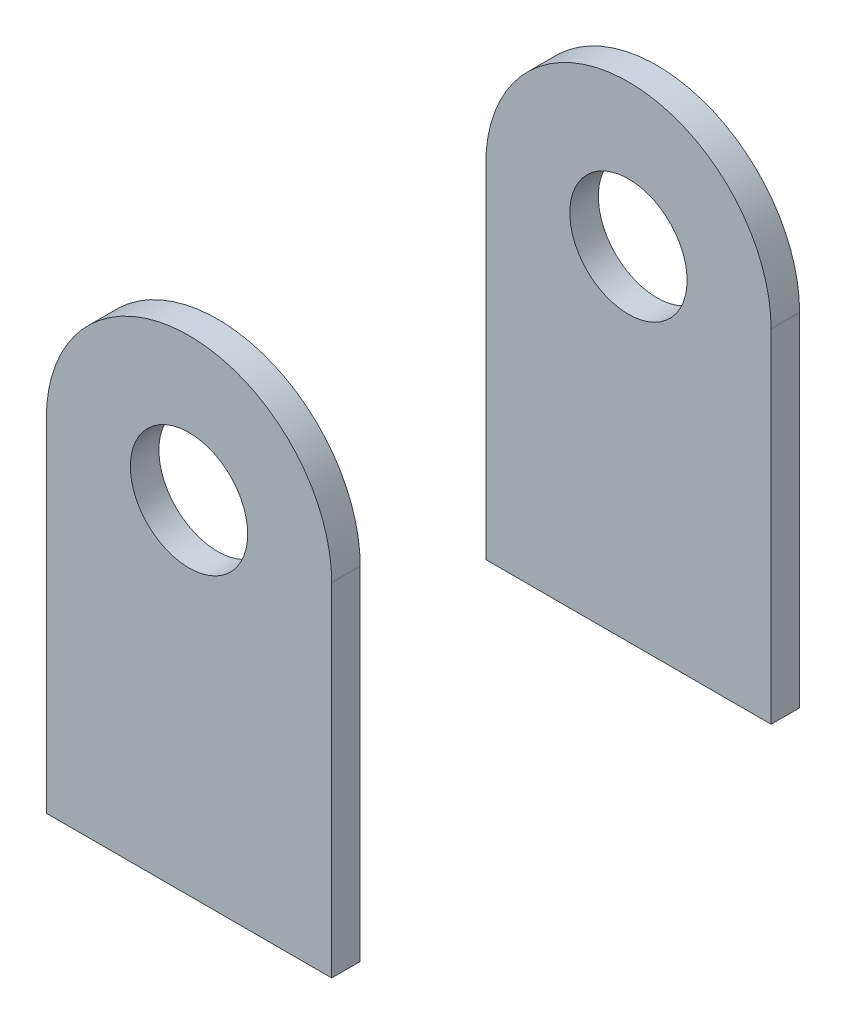
ISO-10303-21;
HEADER;
FILE_DESCRIPTION(('STEP AP214'),'2;1');
FILE_NAME('part.step','',(''),(''),'','','');
FILE_SCHEMA(('AUTOMOTIVE_DESIGN { 1 0 10303 214 1 1 1 1 }'));
ENDSEC;
DATA;
#1=APPLICATION_CONTEXT('core data for automotive mechanical design processes');
#2=APPLICATION_PROTOCOL_DEFINITION('international standard','automotive_design',2000,#1);
#3=PRODUCT_CONTEXT('',#1,'mechanical');
#4=PRODUCT('Part','Part','',(#3));
#5=PRODUCT_RELATED_PRODUCT_CATEGORY('part','',(#4));
#6=PRODUCT_DEFINITION_FORMATION('','',#4);
#7=PRODUCT_DEFINITION_CONTEXT('part definition',#1,'design');
#8=PRODUCT_DEFINITION('design','',#6,#7);
#9=PRODUCT_DEFINITION_SHAPE('','',#8);
#10=(LENGTH_UNIT() NAMED_UNIT(*) SI_UNIT(.MILLI.,.METRE.));
#11=(NAMED_UNIT(*) PLANE_ANGLE_UNIT() SI_UNIT($,.RADIAN.));
#12=(NAMED_UNIT(*) SI_UNIT($,.STERADIAN.) SOLID_ANGLE_UNIT());
#13=UNCERTAINTY_MEASURE_WITH_UNIT(LENGTH_MEASURE(1.E-05),#10,'distance_accuracy_value','');
#14=(GEOMETRIC_REPRESENTATION_CONTEXT(3) GLOBAL_UNCERTAINTY_ASSIGNED_CONTEXT((#13)) GLOBAL_UNIT_ASSIGNED_CONTEXT((#10,
#11,#12)) REPRESENTATION_CONTEXT('',''));
#15=CARTESIAN_POINT('',(0.,0.,0.));
#16=DIRECTION('',(0.,0.,1.));
#17=DIRECTION('',(1.,0.,0.));
#18=AXIS2_PLACEMENT_3D('',#15,#16,#17);
#19=CARTESIAN_POINT('',(0.,-19.05,13.0175));
#20=DIRECTION('',(0.,1.,0.));
#21=DIRECTION('',(0.,0.,-1.));
#22=AXIS2_PLACEMENT_3D('',#19,#20,#21);
#23=PLANE('',#22);
#24=DIRECTION('',(-1.,0.,0.));
#25=VECTOR('',#24,1.);
#26=CARTESIAN_POINT('',(0.,-19.05,11.43));
#27=LINE('',#26,#25);
#28=CARTESIAN_POINT('',(7.9375,-19.05,11.43));
#29=VERTEX_POINT('',#28);
#30=CARTESIAN_POINT('',(-7.9375,-19.05,11.43));
#31=VERTEX_POINT('',#30);
#32=EDGE_CURVE('E121',#29,#31,#27,.T.);
#33=ORIENTED_EDGE('',*,*,#32,.F.);
#34=DIRECTION('',(0.,0.,-1.));
#35=VECTOR('',#34,1.);
#36=CARTESIAN_POINT('',(7.9375,-19.05,13.0175));
#37=LINE('',#36,#35);
#38=CARTESIAN_POINT('',(7.9375,-19.05,13.0175));
#39=VERTEX_POINT('',#38);
#40=EDGE_CURVE('E56',#39,#29,#37,.T.);
#41=ORIENTED_EDGE('',*,*,#40,.F.);
#42=DIRECTION('',(-1.,0.,0.));
#43=VECTOR('',#42,1.);
#44=CARTESIAN_POINT('',(0.,-19.05,13.0175));
#45=LINE('',#44,#43);
#46=CARTESIAN_POINT('',(-7.9375,-19.05,13.0175));
#47=VERTEX_POINT('',#46);
#48=EDGE_CURVE('E107',#39,#47,#45,.T.);
#49=ORIENTED_EDGE('',*,*,#48,.T.);
#50=DIRECTION('',(0.,0.,-1.));
#51=VECTOR('',#50,1.);
#52=CARTESIAN_POINT('',(-7.9375,-19.05,13.0175));
#53=LINE('',#52,#51);
#54=EDGE_CURVE('E12',#47,#31,#53,.T.);
#55=ORIENTED_EDGE('',*,*,#54,.T.);
#56=EDGE_LOOP('',(#33,#41,#49,#55));
#57=FACE_BOUND('',#56,.T.);
#58=ADVANCED_FACE('F53',(#57),#23,.F.);
#59=CARTESIAN_POINT('',(-7.9375,0.,13.0175));
#60=DIRECTION('',(1.,0.,0.));
#61=DIRECTION('',(0.,1.,0.));
#62=AXIS2_PLACEMENT_3D('',#59,#60,#61);
#63=PLANE('',#62);
#64=DIRECTION('',(0.,1.,0.));
#65=VECTOR('',#64,1.);
#66=CARTESIAN_POINT('',(-7.9375,0.,11.43));
#67=LINE('',#66,#65);
#68=CARTESIAN_POINT('',(-7.9375,0.,11.43));
#69=VERTEX_POINT('',#68);
#70=EDGE_CURVE('E94',#31,#69,#67,.T.);
#71=ORIENTED_EDGE('',*,*,#70,.F.);
#72=ORIENTED_EDGE('',*,*,#54,.F.);
#73=DIRECTION('',(0.,1.,0.));
#74=VECTOR('',#73,1.);
#75=CARTESIAN_POINT('',(-7.9375,0.,13.0175));
#76=LINE('',#75,#74);
#77=CARTESIAN_POINT('',(-7.9375,0.,13.0175));
#78=VERTEX_POINT('',#77);
#79=EDGE_CURVE('E71',#47,#78,#76,.T.);
#80=ORIENTED_EDGE('',*,*,#79,.T.);
#81=DIRECTION('',(0.,0.,-1.));
#82=VECTOR('',#81,1.);
#83=CARTESIAN_POINT('',(-7.9375,0.,13.0175));
#84=LINE('',#83,#82);
#85=EDGE_CURVE('E62',#78,#69,#84,.T.);
#86=ORIENTED_EDGE('',*,*,#85,.T.);
#87=EDGE_LOOP('',(#71,#72,#80,#86));
#88=FACE_BOUND('',#87,.T.);
#89=ADVANCED_FACE('F130',(#88),#63,.F.);
#90=CARTESIAN_POINT('',(0.,0.,13.0175));
#91=DIRECTION('',(0.,0.,-1.));
#92=DIRECTION('',(1.,0.,0.));
#93=AXIS2_PLACEMENT_3D('',#90,#91,#92);
#94=CYLINDRICAL_SURFACE('',#93,7.9375);
#95=CARTESIAN_POINT('',(0.,0.,11.43));
#96=DIRECTION('',(0.,0.,1.));
#97=DIRECTION('',(1.,0.,0.));
#98=AXIS2_PLACEMENT_3D('',#95,#96,#97);
#99=CIRCLE('',#98,7.9375);
#100=CARTESIAN_POINT('',(7.9375,0.,11.43));
#101=VERTEX_POINT('',#100);
#102=EDGE_CURVE('E88',#101,#69,#99,.T.);
#103=ORIENTED_EDGE('',*,*,#102,.T.);
#104=ORIENTED_EDGE('',*,*,#85,.F.);
#105=CARTESIAN_POINT('',(0.,0.,13.0175));
#106=DIRECTION('',(0.,0.,1.));
#107=DIRECTION('',(1.,0.,0.));
#108=AXIS2_PLACEMENT_3D('',#105,#106,#107);
#109=CIRCLE('',#108,7.9375);
#110=CARTESIAN_POINT('',(7.9375,0.,13.0175));
#111=VERTEX_POINT('',#110);
#112=EDGE_CURVE('E105',#111,#78,#109,.T.);
#113=ORIENTED_EDGE('',*,*,#112,.F.);
#114=DIRECTION('',(0.,0.,-1.));
#115=VECTOR('',#114,1.);
#116=CARTESIAN_POINT('',(7.9375,0.,13.0175));
#117=LINE('',#116,#115);
#118=EDGE_CURVE('E110',#111,#101,#117,.T.);
#119=ORIENTED_EDGE('',*,*,#118,.T.);
#120=EDGE_LOOP('',(#103,#104,#113,#119));
#121=FACE_BOUND('',#120,.T.);
#122=ADVANCED_FACE('F113',(#121),#94,.T.);
#123=CARTESIAN_POINT('',(7.9375,0.,13.0175));
#124=DIRECTION('',(-1.,0.,0.));
#125=DIRECTION('',(0.,-1.,0.));
#126=AXIS2_PLACEMENT_3D('',#123,#124,#125);
#127=PLANE('',#126);
#128=DIRECTION('',(0.,-1.,0.));
#129=VECTOR('',#128,1.);
#130=CARTESIAN_POINT('',(7.9375,0.,11.43));
#131=LINE('',#130,#129);
#132=EDGE_CURVE('E112',#101,#29,#131,.T.);
#133=ORIENTED_EDGE('',*,*,#132,.F.);
#134=ORIENTED_EDGE('',*,*,#118,.F.);
#135=DIRECTION('',(0.,-1.,0.));
#136=VECTOR('',#135,1.);
#137=CARTESIAN_POINT('',(7.9375,0.,13.0175));
#138=LINE('',#137,#136);
#139=EDGE_CURVE('E101',#111,#39,#138,.T.);
#140=ORIENTED_EDGE('',*,*,#139,.T.);
#141=ORIENTED_EDGE('',*,*,#40,.T.);
#142=EDGE_LOOP('',(#133,#134,#140,#141));
#143=FACE_BOUND('',#142,.T.);
#144=ADVANCED_FACE('F111',(#143),#127,.F.);
#145=CARTESIAN_POINT('',(0.,0.,13.0175));
#146=DIRECTION('',(0.,0.,-1.));
#147=DIRECTION('',(1.,0.,0.));
#148=AXIS2_PLACEMENT_3D('',#145,#146,#147);
#149=CYLINDRICAL_SURFACE('',#148,3.2639);
#150=CARTESIAN_POINT('',(0.,0.,13.0175));
#151=DIRECTION('',(0.,0.,1.));
#152=DIRECTION('',(1.,0.,0.));
#153=AXIS2_PLACEMENT_3D('',#150,#151,#152);
#154=CIRCLE('',#153,3.2639);
#155=CARTESIAN_POINT('',(3.2639,0.,13.0175));
#156=VERTEX_POINT('',#155);
#157=EDGE_CURVE('E115',#156,#156,#154,.T.);
#158=ORIENTED_EDGE('',*,*,#157,.T.);
#159=EDGE_LOOP('',(#158));
#160=FACE_BOUND('',#159,.T.);
#161=CARTESIAN_POINT('',(0.,0.,11.43));
#162=DIRECTION('',(0.,0.,1.));
#163=DIRECTION('',(1.,0.,0.));
#164=AXIS2_PLACEMENT_3D('',#161,#162,#163);
#165=CIRCLE('',#164,3.2639);
#166=CARTESIAN_POINT('',(3.2639,0.,11.43));
#167=VERTEX_POINT('',#166);
#168=EDGE_CURVE('E127',#167,#167,#165,.T.);
#169=ORIENTED_EDGE('',*,*,#168,.F.);
#170=EDGE_LOOP('',(#169));
#171=FACE_BOUND('',#170,.T.);
#172=ADVANCED_FACE('F146',(#160,#171),#149,.F.);
#173=CARTESIAN_POINT('',(0.,0.,13.0175));
#174=DIRECTION('',(0.,0.,-1.));
#175=DIRECTION('',(1.,0.,0.));
#176=AXIS2_PLACEMENT_3D('',#173,#174,#175);
#177=PLANE('',#176);
#178=ORIENTED_EDGE('',*,*,#48,.F.);
#179=ORIENTED_EDGE('',*,*,#139,.F.);
#180=ORIENTED_EDGE('',*,*,#112,.T.);
#181=ORIENTED_EDGE('',*,*,#79,.F.);
#182=EDGE_LOOP('',(#178,#179,#180,#181));
#183=FACE_BOUND('',#182,.T.);
#184=ORIENTED_EDGE('',*,*,#157,.F.);
#185=EDGE_LOOP('',(#184));
#186=FACE_BOUND('',#185,.T.);
#187=ADVANCED_FACE('F102',(#183,#186),#177,.F.);
#188=CARTESIAN_POINT('',(0.,0.,11.43));
#189=DIRECTION('',(0.,0.,-1.));
#190=DIRECTION('',(1.,0.,0.));
#191=AXIS2_PLACEMENT_3D('',#188,#189,#190);
#192=PLANE('',#191);
#193=ORIENTED_EDGE('',*,*,#32,.T.);
#194=ORIENTED_EDGE('',*,*,#70,.T.);
#195=ORIENTED_EDGE('',*,*,#102,.F.);
#196=ORIENTED_EDGE('',*,*,#132,.T.);
#197=EDGE_LOOP('',(#193,#194,#195,#196));
#198=FACE_BOUND('',#197,.T.);
#199=ORIENTED_EDGE('',*,*,#168,.T.);
#200=EDGE_LOOP('',(#199));
#201=FACE_BOUND('',#200,.T.);
#202=ADVANCED_FACE('F132',(#198,#201),#192,.T.);
#203=CLOSED_SHELL('',(#58,#89,#122,#144,#172,#187,#202));
#204=MANIFOLD_SOLID_BREP('B2',#203);
#205=CARTESIAN_POINT('',(0.,-19.05,-13.0175));
#206=DIRECTION('',(0.,-1.,0.));
#207=DIRECTION('',(0.,0.,1.));
#208=AXIS2_PLACEMENT_3D('',#205,#206,#207);
#209=PLANE('',#208);
#210=DIRECTION('',(-1.,0.,0.));
#211=VECTOR('',#210,1.);
#212=CARTESIAN_POINT('',(0.,-19.05,-11.43));
#213=LINE('',#212,#211);
#214=CARTESIAN_POINT('',(7.9375,-19.05,-11.43));
#215=VERTEX_POINT('',#214);
#216=CARTESIAN_POINT('',(-7.9375,-19.05,-11.43));
#217=VERTEX_POINT('',#216);
#218=EDGE_CURVE('E278',#215,#217,#213,.T.);
#219=ORIENTED_EDGE('',*,*,#218,.T.);
#220=DIRECTION('',(0.,0.,1.));
#221=VECTOR('',#220,1.);
#222=CARTESIAN_POINT('',(-7.9375,-19.05,-13.0175));
#223=LINE('',#222,#221);
#224=CARTESIAN_POINT('',(-7.9375,-19.05,-13.0175));
#225=VERTEX_POINT('',#224);
#226=EDGE_CURVE('E277',#225,#217,#223,.T.);
#227=ORIENTED_EDGE('',*,*,#226,.F.);
#228=DIRECTION('',(-1.,0.,0.));
#229=VECTOR('',#228,1.);
#230=CARTESIAN_POINT('',(0.,-19.05,-13.0175));
#231=LINE('',#230,#229);
#232=CARTESIAN_POINT('',(7.9375,-19.05,-13.0175));
#233=VERTEX_POINT('',#232);
#234=EDGE_CURVE('E268',#233,#225,#231,.T.);
#235=ORIENTED_EDGE('',*,*,#234,.F.);
#236=DIRECTION('',(0.,0.,1.));
#237=VECTOR('',#236,1.);
#238=CARTESIAN_POINT('',(7.9375,-19.05,-13.0175));
#239=LINE('',#238,#237);
#240=EDGE_CURVE('E51',#233,#215,#239,.T.);
#241=ORIENTED_EDGE('',*,*,#240,.T.);
#242=EDGE_LOOP('',(#219,#227,#235,#241));
#243=FACE_BOUND('',#242,.T.);
#244=ADVANCED_FACE('F210',(#243),#209,.T.);
#245=CARTESIAN_POINT('',(7.9375,0.,-13.0175));
#246=DIRECTION('',(1.,0.,0.));
#247=DIRECTION('',(0.,1.,0.));
#248=AXIS2_PLACEMENT_3D('',#245,#246,#247);
#249=PLANE('',#248);
#250=DIRECTION('',(0.,-1.,0.));
#251=VECTOR('',#250,1.);
#252=CARTESIAN_POINT('',(7.9375,0.,-11.43));
#253=LINE('',#252,#251);
#254=CARTESIAN_POINT('',(7.9375,0.,-11.43));
#255=VERTEX_POINT('',#254);
#256=EDGE_CURVE('E281',#255,#215,#253,.T.);
#257=ORIENTED_EDGE('',*,*,#256,.T.);
#258=ORIENTED_EDGE('',*,*,#240,.F.);
#259=DIRECTION('',(0.,-1.,0.));
#260=VECTOR('',#259,1.);
#261=CARTESIAN_POINT('',(7.9375,0.,-13.0175));
#262=LINE('',#261,#260);
#263=CARTESIAN_POINT('',(7.9375,0.,-13.0175));
#264=VERTEX_POINT('',#263);
#265=EDGE_CURVE('E251',#264,#233,#262,.T.);
#266=ORIENTED_EDGE('',*,*,#265,.F.);
#267=DIRECTION('',(0.,0.,1.));
#268=VECTOR('',#267,1.);
#269=CARTESIAN_POINT('',(7.9375,0.,-13.0175));
#270=LINE('',#269,#268);
#271=EDGE_CURVE('E218',#264,#255,#270,.T.);
#272=ORIENTED_EDGE('',*,*,#271,.T.);
#273=EDGE_LOOP('',(#257,#258,#266,#272));
#274=FACE_BOUND('',#273,.T.);
#275=ADVANCED_FACE('F266',(#274),#249,.T.);
#276=CARTESIAN_POINT('',(0.,0.,-13.0175));
#277=DIRECTION('',(0.,0.,1.));
#278=DIRECTION('',(-1.,0.,0.));
#279=AXIS2_PLACEMENT_3D('',#276,#277,#278);
#280=CYLINDRICAL_SURFACE('',#279,7.9375);
#281=CARTESIAN_POINT('',(0.,0.,-11.43));
#282=DIRECTION('',(0.,0.,1.));
#283=DIRECTION('',(1.,0.,0.));
#284=AXIS2_PLACEMENT_3D('',#281,#282,#283);
#285=CIRCLE('',#284,7.9375);
#286=CARTESIAN_POINT('',(-7.9375,0.,-11.43));
#287=VERTEX_POINT('',#286);
#288=EDGE_CURVE('E262',#255,#287,#285,.T.);
#289=ORIENTED_EDGE('',*,*,#288,.F.);
#290=ORIENTED_EDGE('',*,*,#271,.F.);
#291=CARTESIAN_POINT('',(0.,0.,-13.0175));
#292=DIRECTION('',(0.,0.,1.));
#293=DIRECTION('',(1.,0.,0.));
#294=AXIS2_PLACEMENT_3D('',#291,#292,#293);
#295=CIRCLE('',#294,7.9375);
#296=CARTESIAN_POINT('',(-7.9375,0.,-13.0175));
#297=VERTEX_POINT('',#296);
#298=EDGE_CURVE('E254',#264,#297,#295,.T.);
#299=ORIENTED_EDGE('',*,*,#298,.T.);
#300=DIRECTION('',(0.,0.,1.));
#301=VECTOR('',#300,1.);
#302=CARTESIAN_POINT('',(-7.9375,0.,-13.0175));
#303=LINE('',#302,#301);
#304=EDGE_CURVE('E265',#297,#287,#303,.T.);
#305=ORIENTED_EDGE('',*,*,#304,.T.);
#306=EDGE_LOOP('',(#289,#290,#299,#305));
#307=FACE_BOUND('',#306,.T.);
#308=ADVANCED_FACE('F261',(#307),#280,.T.);
#309=CARTESIAN_POINT('',(-7.9375,0.,-13.0175));
#310=DIRECTION('',(-1.,0.,0.));
#311=DIRECTION('',(0.,-1.,0.));
#312=AXIS2_PLACEMENT_3D('',#309,#310,#311);
#313=PLANE('',#312);
#314=DIRECTION('',(0.,1.,0.));
#315=VECTOR('',#314,1.);
#316=CARTESIAN_POINT('',(-7.9375,0.,-11.43));
#317=LINE('',#316,#315);
#318=EDGE_CURVE('E240',#217,#287,#317,.T.);
#319=ORIENTED_EDGE('',*,*,#318,.T.);
#320=ORIENTED_EDGE('',*,*,#304,.F.);
#321=DIRECTION('',(0.,1.,0.));
#322=VECTOR('',#321,1.);
#323=CARTESIAN_POINT('',(-7.9375,0.,-13.0175));
#324=LINE('',#323,#322);
#325=EDGE_CURVE('E226',#225,#297,#324,.T.);
#326=ORIENTED_EDGE('',*,*,#325,.F.);
#327=ORIENTED_EDGE('',*,*,#226,.T.);
#328=EDGE_LOOP('',(#319,#320,#326,#327));
#329=FACE_BOUND('',#328,.T.);
#330=ADVANCED_FACE('F292',(#329),#313,.T.);
#331=CARTESIAN_POINT('',(0.,0.,-13.0175));
#332=DIRECTION('',(0.,0.,1.));
#333=DIRECTION('',(-1.,0.,0.));
#334=AXIS2_PLACEMENT_3D('',#331,#332,#333);
#335=CYLINDRICAL_SURFACE('',#334,3.2639);
#336=CARTESIAN_POINT('',(0.,0.,-13.0175));
#337=DIRECTION('',(0.,0.,1.));
#338=DIRECTION('',(1.,0.,0.));
#339=AXIS2_PLACEMENT_3D('',#336,#337,#338);
#340=CIRCLE('',#339,3.2639);
#341=CARTESIAN_POINT('',(3.2639,0.,-13.0175));
#342=VERTEX_POINT('',#341);
#343=EDGE_CURVE('E274',#342,#342,#340,.T.);
#344=ORIENTED_EDGE('',*,*,#343,.F.);
#345=EDGE_LOOP('',(#344));
#346=FACE_BOUND('',#345,.T.);
#347=CARTESIAN_POINT('',(0.,0.,-11.43));
#348=DIRECTION('',(0.,0.,1.));
#349=DIRECTION('',(1.,0.,0.));
#350=AXIS2_PLACEMENT_3D('',#347,#348,#349);
#351=CIRCLE('',#350,3.2639);
#352=CARTESIAN_POINT('',(3.2639,0.,-11.43));
#353=VERTEX_POINT('',#352);
#354=EDGE_CURVE('E270',#353,#353,#351,.T.);
#355=ORIENTED_EDGE('',*,*,#354,.T.);
#356=EDGE_LOOP('',(#355));
#357=FACE_BOUND('',#356,.T.);
#358=ADVANCED_FACE('F294',(#346,#357),#335,.F.);
#359=CARTESIAN_POINT('',(0.,0.,-13.0175));
#360=DIRECTION('',(0.,0.,-1.));
#361=DIRECTION('',(1.,0.,0.));
#362=AXIS2_PLACEMENT_3D('',#359,#360,#361);
#363=PLANE('',#362);
#364=ORIENTED_EDGE('',*,*,#234,.T.);
#365=ORIENTED_EDGE('',*,*,#325,.T.);
#366=ORIENTED_EDGE('',*,*,#298,.F.);
#367=ORIENTED_EDGE('',*,*,#265,.T.);
#368=EDGE_LOOP('',(#364,#365,#366,#367));
#369=FACE_BOUND('',#368,.T.);
#370=ORIENTED_EDGE('',*,*,#343,.T.);
#371=EDGE_LOOP('',(#370));
#372=FACE_BOUND('',#371,.T.);
#373=ADVANCED_FACE('F256',(#369,#372),#363,.T.);
#374=CARTESIAN_POINT('',(0.,0.,-11.43));
#375=DIRECTION('',(0.,0.,-1.));
#376=DIRECTION('',(1.,0.,0.));
#377=AXIS2_PLACEMENT_3D('',#374,#375,#376);
#378=PLANE('',#377);
#379=ORIENTED_EDGE('',*,*,#218,.F.);
#380=ORIENTED_EDGE('',*,*,#256,.F.);
#381=ORIENTED_EDGE('',*,*,#288,.T.);
#382=ORIENTED_EDGE('',*,*,#318,.F.);
#383=EDGE_LOOP('',(#379,#380,#381,#382));
#384=FACE_BOUND('',#383,.T.);
#385=ORIENTED_EDGE('',*,*,#354,.F.);
#386=EDGE_LOOP('',(#385));
#387=FACE_BOUND('',#386,.T.);
#388=ADVANCED_FACE('F288',(#384,#387),#378,.F.);
#389=CLOSED_SHELL('',(#244,#275,#308,#330,#358,#373,#388));
#390=MANIFOLD_SOLID_BREP('B6',#389);
#391=ADVANCED_BREP_SHAPE_REPRESENTATION('',(#18,#204,#390),#14);
#392=SHAPE_DEFINITION_REPRESENTATION(#9,#391);
ENDSEC;
END-ISO-10303-21;
